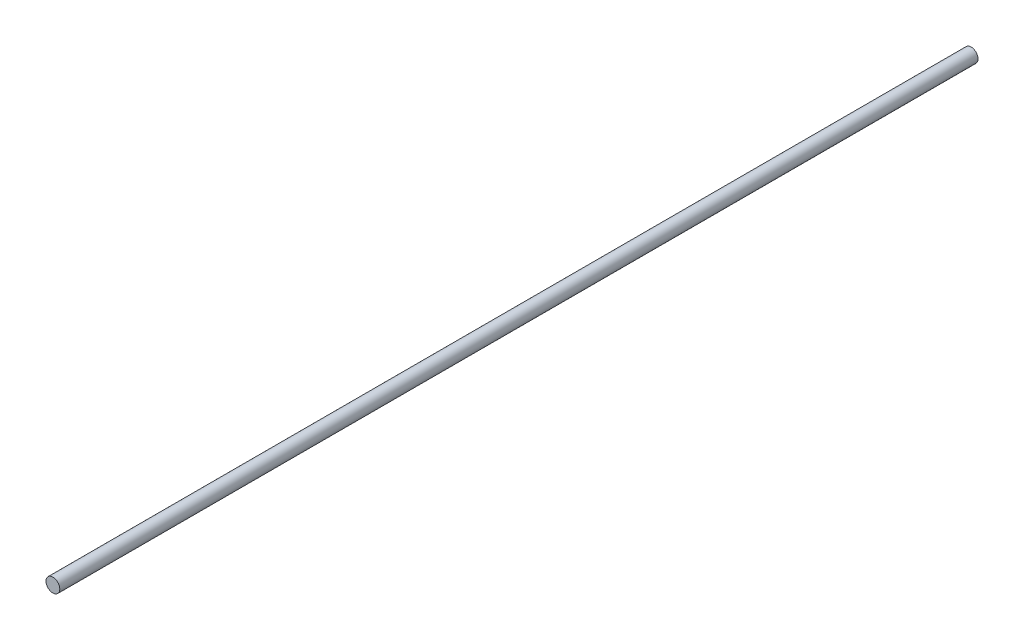
ISO-10303-21;
HEADER;
FILE_DESCRIPTION(('STEP AP214'),'2;1');
FILE_NAME('part.step','',(''),(''),'','','');
FILE_SCHEMA(('AUTOMOTIVE_DESIGN { 1 0 10303 214 1 1 1 1 }'));
ENDSEC;
DATA;
#1=APPLICATION_CONTEXT('core data for automotive mechanical design processes');
#2=APPLICATION_PROTOCOL_DEFINITION('international standard','automotive_design',2000,#1);
#3=PRODUCT_CONTEXT('',#1,'mechanical');
#4=PRODUCT('Part','Part','',(#3));
#5=PRODUCT_RELATED_PRODUCT_CATEGORY('part','',(#4));
#6=PRODUCT_DEFINITION_FORMATION('','',#4);
#7=PRODUCT_DEFINITION_CONTEXT('part definition',#1,'design');
#8=PRODUCT_DEFINITION('design','',#6,#7);
#9=PRODUCT_DEFINITION_SHAPE('','',#8);
#10=(LENGTH_UNIT() NAMED_UNIT(*) SI_UNIT(.MILLI.,.METRE.));
#11=(NAMED_UNIT(*) PLANE_ANGLE_UNIT() SI_UNIT($,.RADIAN.));
#12=(NAMED_UNIT(*) SI_UNIT($,.STERADIAN.) SOLID_ANGLE_UNIT());
#13=UNCERTAINTY_MEASURE_WITH_UNIT(LENGTH_MEASURE(1.E-05),#10,'distance_accuracy_value','');
#14=(GEOMETRIC_REPRESENTATION_CONTEXT(3) GLOBAL_UNCERTAINTY_ASSIGNED_CONTEXT((#13)) GLOBAL_UNIT_ASSIGNED_CONTEXT((#10,
#11,#12)) REPRESENTATION_CONTEXT('',''));
#15=CARTESIAN_POINT('',(0.,0.,0.));
#16=DIRECTION('',(0.,0.,1.));
#17=DIRECTION('',(1.,0.,0.));
#18=AXIS2_PLACEMENT_3D('',#15,#16,#17);
#19=CARTESIAN_POINT('',(0.,0.,1270.));
#20=DIRECTION('',(0.,0.,-1.));
#21=DIRECTION('',(-1.,0.,0.));
#22=AXIS2_PLACEMENT_3D('',#19,#20,#21);
#23=CYLINDRICAL_SURFACE('',#22,9.525);
#24=CARTESIAN_POINT('',(0.,0.,1270.));
#25=DIRECTION('',(0.,0.,1.));
#26=DIRECTION('',(1.,0.,0.));
#27=AXIS2_PLACEMENT_3D('',#24,#25,#26);
#28=CIRCLE('',#27,9.525);
#29=CARTESIAN_POINT('',(-9.525,0.,1270.));
#30=VERTEX_POINT('',#29);
#31=EDGE_CURVE('E10',#30,#30,#28,.T.);
#32=CARTESIAN_POINT('',(0.,0.,0.));
#33=DIRECTION('',(0.,0.,1.));
#34=DIRECTION('',(1.,0.,0.));
#35=AXIS2_PLACEMENT_3D('',#32,#33,#34);
#36=CIRCLE('',#35,9.525);
#37=CARTESIAN_POINT('',(-9.525,0.,-2.22044604925031E-13));
#38=VERTEX_POINT('',#37);
#39=EDGE_CURVE('E42',#38,#38,#36,.T.);
#40=CARTESIAN_POINT('',(-9.525,0.,1270.));
#41=CARTESIAN_POINT('',(-9.525,0.,1256.77083333333));
#42=CARTESIAN_POINT('',(-9.525,0.,1243.54166666667));
#43=CARTESIAN_POINT('',(-9.525,0.,1217.08333333333));
#44=CARTESIAN_POINT('',(-9.525,0.,1203.85416666667));
#45=CARTESIAN_POINT('',(-9.525,0.,1177.39583333333));
#46=CARTESIAN_POINT('',(-9.525,0.,1164.16666666667));
#47=CARTESIAN_POINT('',(-9.525,0.,1137.70833333333));
#48=CARTESIAN_POINT('',(-9.525,0.,1124.47916666667));
#49=CARTESIAN_POINT('',(-9.525,0.,1098.02083333333));
#50=CARTESIAN_POINT('',(-9.525,0.,1084.79166666667));
#51=CARTESIAN_POINT('',(-9.525,0.,1058.33333333333));
#52=CARTESIAN_POINT('',(-9.525,0.,1045.10416666667));
#53=CARTESIAN_POINT('',(-9.525,0.,1018.64583333333));
#54=CARTESIAN_POINT('',(-9.525,0.,1005.41666666667));
#55=CARTESIAN_POINT('',(-9.525,0.,978.958333333333));
#56=CARTESIAN_POINT('',(-9.525,0.,965.729166666667));
#57=CARTESIAN_POINT('',(-9.525,0.,939.270833333333));
#58=CARTESIAN_POINT('',(-9.525,0.,926.041666666667));
#59=CARTESIAN_POINT('',(-9.525,0.,899.583333333333));
#60=CARTESIAN_POINT('',(-9.525,0.,886.354166666666));
#61=CARTESIAN_POINT('',(-9.525,0.,859.895833333333));
#62=CARTESIAN_POINT('',(-9.525,0.,846.666666666666));
#63=CARTESIAN_POINT('',(-9.525,0.,820.208333333333));
#64=CARTESIAN_POINT('',(-9.525,0.,806.979166666667));
#65=CARTESIAN_POINT('',(-9.525,0.,780.520833333333));
#66=CARTESIAN_POINT('',(-9.525,0.,767.291666666667));
#67=CARTESIAN_POINT('',(-9.525,0.,740.833333333333));
#68=CARTESIAN_POINT('',(-9.525,0.,727.604166666667));
#69=CARTESIAN_POINT('',(-9.525,0.,701.145833333333));
#70=CARTESIAN_POINT('',(-9.525,0.,687.916666666666));
#71=CARTESIAN_POINT('',(-9.525,0.,661.458333333333));
#72=CARTESIAN_POINT('',(-9.525,0.,648.229166666666));
#73=CARTESIAN_POINT('',(-9.525,0.,621.770833333333));
#74=CARTESIAN_POINT('',(-9.525,0.,608.541666666666));
#75=CARTESIAN_POINT('',(-9.525,0.,582.083333333333));
#76=CARTESIAN_POINT('',(-9.525,0.,568.854166666666));
#77=CARTESIAN_POINT('',(-9.525,0.,542.395833333333));
#78=CARTESIAN_POINT('',(-9.525,0.,529.166666666666));
#79=CARTESIAN_POINT('',(-9.525,0.,502.708333333333));
#80=CARTESIAN_POINT('',(-9.525,0.,489.479166666666));
#81=CARTESIAN_POINT('',(-9.525,0.,463.020833333333));
#82=CARTESIAN_POINT('',(-9.525,0.,449.791666666666));
#83=CARTESIAN_POINT('',(-9.525,0.,423.333333333333));
#84=CARTESIAN_POINT('',(-9.525,0.,410.104166666666));
#85=CARTESIAN_POINT('',(-9.525,0.,383.645833333333));
#86=CARTESIAN_POINT('',(-9.525,0.,370.416666666666));
#87=CARTESIAN_POINT('',(-9.525,0.,343.958333333333));
#88=CARTESIAN_POINT('',(-9.525,0.,330.729166666666));
#89=CARTESIAN_POINT('',(-9.525,0.,304.270833333333));
#90=CARTESIAN_POINT('',(-9.525,0.,291.041666666666));
#91=CARTESIAN_POINT('',(-9.525,0.,264.583333333333));
#92=CARTESIAN_POINT('',(-9.525,0.,251.354166666666));
#93=CARTESIAN_POINT('',(-9.525,0.,224.895833333333));
#94=CARTESIAN_POINT('',(-9.525,0.,211.666666666667));
#95=CARTESIAN_POINT('',(-9.525,0.,185.208333333333));
#96=CARTESIAN_POINT('',(-9.525,0.,171.979166666666));
#97=CARTESIAN_POINT('',(-9.525,0.,145.520833333333));
#98=CARTESIAN_POINT('',(-9.525,0.,132.291666666666));
#99=CARTESIAN_POINT('',(-9.525,0.,105.833333333333));
#100=CARTESIAN_POINT('',(-9.525,0.,92.6041666666664));
#101=CARTESIAN_POINT('',(-9.525,0.,66.1458333333331));
#102=CARTESIAN_POINT('',(-9.525,0.,52.9166666666665));
#103=CARTESIAN_POINT('',(-9.525,0.,26.4583333333332));
#104=CARTESIAN_POINT('',(-9.525,0.,13.2291666666665));
#105=CARTESIAN_POINT('',(-9.525,0.,-2.22044604925031E-13));
#106=B_SPLINE_CURVE_WITH_KNOTS('',3,(#40,#41,#42,#43,#44,#45,#46,#47,#48,#49,#50,#51,#52,#53,
#54,#55,#56,#57,#58,#59,#60,#61,#62,#63,#64,#65,#66,#67,#68,#69,#70,#71,#72,#73,#74,#75,#76,#77,
#78,#79,#80,#81,#82,#83,#84,#85,#86,#87,#88,#89,#90,#91,#92,#93,#94,#95,#96,#97,#98,#99,#100,
#101,#102,#103,#104,#105),.UNSPECIFIED.,.F.,.F.,(4,2,2,2,2,2,2,2,2,2,2,2,2,2,2,2,2,2,2,2,2,2,2,
2,2,2,2,2,2,2,2,2,4),(0.,39.6875000000001,79.3750000000002,119.0625,158.75,198.4375,238.125,
277.8125,317.5,357.1875,396.875,436.5625,476.25,515.9375,555.625,595.3125,635.,674.6875,714.375,
754.0625,793.75,833.4375,873.125,912.8125,952.5,992.1875,1031.875,1071.5625,1111.25,1150.9375,
1190.625,1230.3125,1270.),.UNSPECIFIED.);
#107=EDGE_CURVE('BSEAM39',#30,#38,#106,.T.);
#108=ORIENTED_EDGE('',*,*,#31,.F.);
#109=ORIENTED_EDGE('',*,*,#39,.T.);
#110=ORIENTED_EDGE('',*,*,#107,.T.);
#111=ORIENTED_EDGE('',*,*,#107,.F.);
#112=EDGE_LOOP('',(#108,#110,#109,#111));
#113=FACE_BOUND('',#112,.T.);
#114=ADVANCED_FACE('F39',(#113),#23,.T.);
#115=CARTESIAN_POINT('',(0.,0.,1270.));
#116=DIRECTION('',(0.,0.,1.));
#117=DIRECTION('',(1.,0.,0.));
#118=AXIS2_PLACEMENT_3D('',#115,#116,#117);
#119=PLANE('',#118);
#120=ORIENTED_EDGE('',*,*,#31,.T.);
#121=EDGE_LOOP('',(#120));
#122=FACE_BOUND('',#121,.T.);
#123=ADVANCED_FACE('F56',(#122),#119,.T.);
#124=CARTESIAN_POINT('',(0.,0.,0.));
#125=DIRECTION('',(0.,0.,1.));
#126=DIRECTION('',(1.,0.,0.));
#127=AXIS2_PLACEMENT_3D('',#124,#125,#126);
#128=PLANE('',#127);
#129=ORIENTED_EDGE('',*,*,#39,.F.);
#130=EDGE_LOOP('',(#129));
#131=FACE_BOUND('',#130,.T.);
#132=ADVANCED_FACE('F54',(#131),#128,.F.);
#133=CLOSED_SHELL('',(#114,#123,#132));
#134=MANIFOLD_SOLID_BREP('B2',#133);
#135=ADVANCED_BREP_SHAPE_REPRESENTATION('',(#18,#134),#14);
#136=SHAPE_DEFINITION_REPRESENTATION(#9,#135);
ENDSEC;
END-ISO-10303-21;
